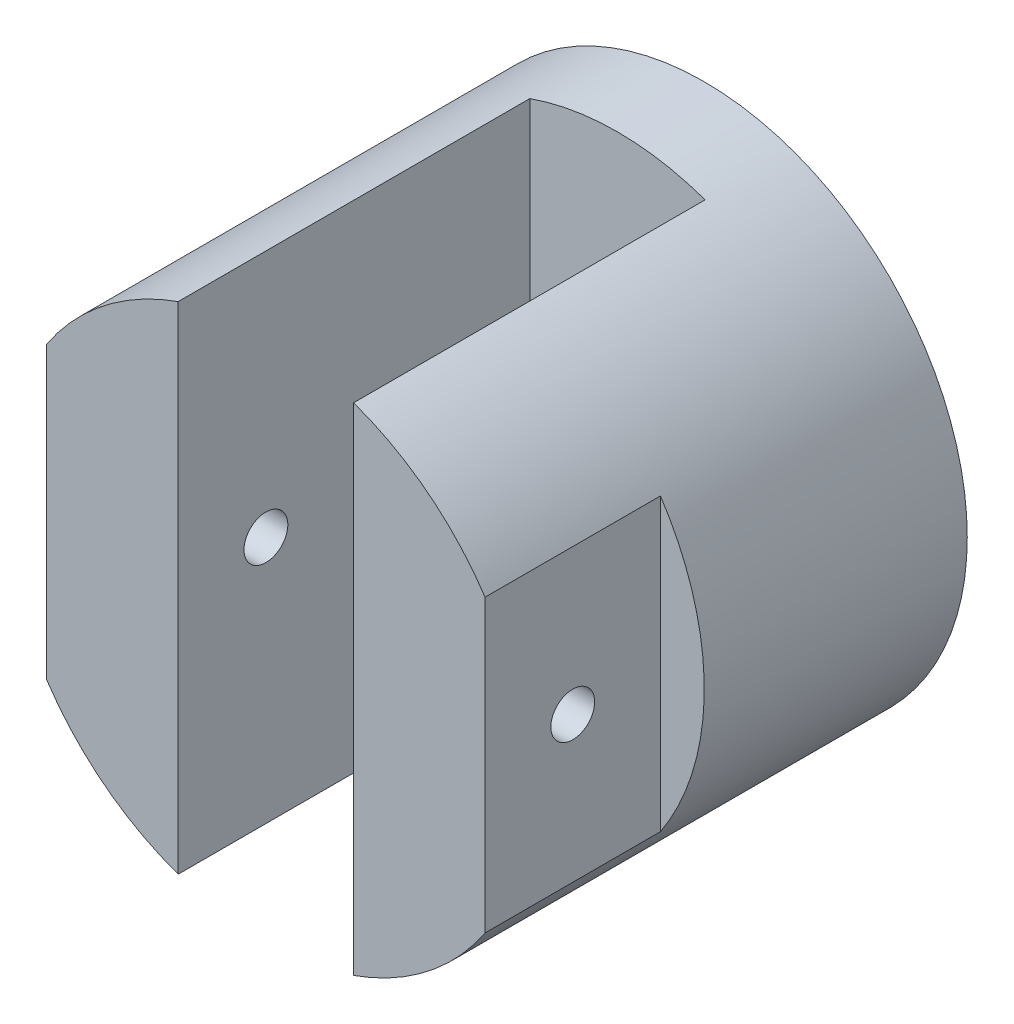
ISO-10303-21;
HEADER;
FILE_DESCRIPTION(('STEP AP214'),'2;1');
FILE_NAME('part.step','',(''),(''),'','','');
FILE_SCHEMA(('AUTOMOTIVE_DESIGN { 1 0 10303 214 1 1 1 1 }'));
ENDSEC;
DATA;
#1=APPLICATION_CONTEXT('core data for automotive mechanical design processes');
#2=APPLICATION_PROTOCOL_DEFINITION('international standard','automotive_design',2000,#1);
#3=PRODUCT_CONTEXT('',#1,'mechanical');
#4=PRODUCT('Part','Part','',(#3));
#5=PRODUCT_RELATED_PRODUCT_CATEGORY('part','',(#4));
#6=PRODUCT_DEFINITION_FORMATION('','',#4);
#7=PRODUCT_DEFINITION_CONTEXT('part definition',#1,'design');
#8=PRODUCT_DEFINITION('design','',#6,#7);
#9=PRODUCT_DEFINITION_SHAPE('','',#8);
#10=(LENGTH_UNIT() NAMED_UNIT(*) SI_UNIT(.MILLI.,.METRE.));
#11=(NAMED_UNIT(*) PLANE_ANGLE_UNIT() SI_UNIT($,.RADIAN.));
#12=(NAMED_UNIT(*) SI_UNIT($,.STERADIAN.) SOLID_ANGLE_UNIT());
#13=UNCERTAINTY_MEASURE_WITH_UNIT(LENGTH_MEASURE(1.E-05),#10,'distance_accuracy_value','');
#14=(GEOMETRIC_REPRESENTATION_CONTEXT(3) GLOBAL_UNCERTAINTY_ASSIGNED_CONTEXT((#13)) GLOBAL_UNIT_ASSIGNED_CONTEXT((#10,
#11,#12)) REPRESENTATION_CONTEXT('',''));
#15=CARTESIAN_POINT('',(0.,0.,0.));
#16=DIRECTION('',(0.,0.,1.));
#17=DIRECTION('',(1.,0.,0.));
#18=AXIS2_PLACEMENT_3D('',#15,#16,#17);
#19=CARTESIAN_POINT('',(0.,0.,63.5));
#20=DIRECTION('',(0.,0.,1.));
#21=DIRECTION('',(1.,0.,0.));
#22=AXIS2_PLACEMENT_3D('',#19,#20,#21);
#23=PLANE('',#22);
#24=CARTESIAN_POINT('',(0.,0.,63.5));
#25=DIRECTION('',(0.,0.,1.));
#26=DIRECTION('',(1.,0.,0.));
#27=AXIS2_PLACEMENT_3D('',#24,#25,#26);
#28=CIRCLE('',#27,38.1);
#29=CARTESIAN_POINT('',(12.7,-35.9210244842766,63.5));
#30=VERTEX_POINT('',#29);
#31=CARTESIAN_POINT('',(31.75,-21.0605674187568,63.5));
#32=VERTEX_POINT('',#31);
#33=EDGE_CURVE('E110',#30,#32,#28,.T.);
#34=ORIENTED_EDGE('',*,*,#33,.T.);
#35=DIRECTION('',(0.,1.,0.));
#36=VECTOR('',#35,1.);
#37=CARTESIAN_POINT('',(31.75,-35.9210244842766,63.5));
#38=LINE('',#37,#36);
#39=CARTESIAN_POINT('',(31.75,21.0605674187568,63.5));
#40=VERTEX_POINT('',#39);
#41=EDGE_CURVE('E96',#32,#40,#38,.T.);
#42=ORIENTED_EDGE('',*,*,#41,.T.);
#43=CARTESIAN_POINT('',(12.7,35.9210244842766,63.5));
#44=VERTEX_POINT('',#43);
#45=EDGE_CURVE('E116',#40,#44,#28,.T.);
#46=ORIENTED_EDGE('',*,*,#45,.T.);
#47=DIRECTION('',(0.,1.,0.));
#48=VECTOR('',#47,1.);
#49=CARTESIAN_POINT('',(12.7,-50.8,63.5));
#50=LINE('',#49,#48);
#51=EDGE_CURVE('E114',#30,#44,#50,.T.);
#52=ORIENTED_EDGE('',*,*,#51,.F.);
#53=EDGE_LOOP('',(#34,#42,#46,#52));
#54=FACE_BOUND('',#53,.T.);
#55=ADVANCED_FACE('F33',(#54),#23,.T.);
#56=CARTESIAN_POINT('',(-50.8,0.,50.8));
#57=DIRECTION('',(1.,0.,0.));
#58=DIRECTION('',(0.,0.,-1.));
#59=AXIS2_PLACEMENT_3D('',#56,#57,#58);
#60=CYLINDRICAL_SURFACE('',#59,3.175);
#61=CARTESIAN_POINT('',(12.7,0.,50.8));
#62=DIRECTION('',(1.,0.,0.));
#63=DIRECTION('',(0.,0.,-1.));
#64=AXIS2_PLACEMENT_3D('',#61,#62,#63);
#65=CIRCLE('',#64,3.175);
#66=CARTESIAN_POINT('',(12.7,0.,47.625));
#67=VERTEX_POINT('',#66);
#68=EDGE_CURVE('E135',#67,#67,#65,.F.);
#69=ORIENTED_EDGE('',*,*,#68,.T.);
#70=EDGE_LOOP('',(#69));
#71=FACE_BOUND('',#70,.T.);
#72=CARTESIAN_POINT('',(31.75,0.,50.8));
#73=DIRECTION('',(1.,0.,0.));
#74=DIRECTION('',(0.,0.,-1.));
#75=AXIS2_PLACEMENT_3D('',#72,#73,#74);
#76=CIRCLE('',#75,3.175);
#77=CARTESIAN_POINT('',(31.75,0.,47.625));
#78=VERTEX_POINT('',#77);
#79=EDGE_CURVE('E152',#78,#78,#76,.F.);
#80=ORIENTED_EDGE('',*,*,#79,.F.);
#81=EDGE_LOOP('',(#80));
#82=FACE_BOUND('',#81,.T.);
#83=ADVANCED_FACE('F215',(#71,#82),#60,.F.);
#84=CARTESIAN_POINT('',(0.,0.,63.5));
#85=DIRECTION('',(0.,0.,-1.));
#86=DIRECTION('',(-1.,0.,0.));
#87=AXIS2_PLACEMENT_3D('',#84,#85,#86);
#88=CYLINDRICAL_SURFACE('',#87,38.1);
#89=CARTESIAN_POINT('',(0.,0.,0.));
#90=DIRECTION('',(0.,0.,1.));
#91=DIRECTION('',(1.,0.,0.));
#92=AXIS2_PLACEMENT_3D('',#89,#90,#91);
#93=CIRCLE('',#92,38.1);
#94=CARTESIAN_POINT('',(38.1,0.,0.));
#95=VERTEX_POINT('',#94);
#96=EDGE_CURVE('E120',#95,#95,#93,.T.);
#97=ORIENTED_EDGE('',*,*,#96,.T.);
#98=EDGE_LOOP('',(#97));
#99=FACE_BOUND('',#98,.T.);
#100=DIRECTION('',(0.,0.,-1.));
#101=VECTOR('',#100,1.);
#102=CARTESIAN_POINT('',(31.75,-21.0605674187568,63.5));
#103=LINE('',#102,#101);
#104=CARTESIAN_POINT('',(31.75,-21.0605674187568,38.1));
#105=VERTEX_POINT('',#104);
#106=EDGE_CURVE('E12',#32,#105,#103,.T.);
#107=ORIENTED_EDGE('',*,*,#106,.F.);
#108=ORIENTED_EDGE('',*,*,#33,.F.);
#109=DIRECTION('',(0.,0.,-1.));
#110=VECTOR('',#109,1.);
#111=CARTESIAN_POINT('',(12.7,-35.9210244842766,63.5));
#112=LINE('',#111,#110);
#113=CARTESIAN_POINT('',(12.7,-35.9210244842766,12.573));
#114=VERTEX_POINT('',#113);
#115=EDGE_CURVE('E176',#30,#114,#112,.T.);
#116=ORIENTED_EDGE('',*,*,#115,.T.);
#117=CARTESIAN_POINT('',(0.,0.,12.573));
#118=DIRECTION('',(0.,0.,-1.));
#119=DIRECTION('',(-1.,0.,0.));
#120=AXIS2_PLACEMENT_3D('',#117,#118,#119);
#121=CIRCLE('',#120,38.1);
#122=CARTESIAN_POINT('',(-12.7,-35.9210244842766,12.573));
#123=VERTEX_POINT('',#122);
#124=EDGE_CURVE('E124',#114,#123,#121,.T.);
#125=ORIENTED_EDGE('',*,*,#124,.T.);
#126=DIRECTION('',(0.,0.,-1.));
#127=VECTOR('',#126,1.);
#128=CARTESIAN_POINT('',(-12.7,-35.9210244842766,63.5));
#129=LINE('',#128,#127);
#130=CARTESIAN_POINT('',(-12.7,-35.9210244842766,63.5));
#131=VERTEX_POINT('',#130);
#132=EDGE_CURVE('E171',#123,#131,#129,.F.);
#133=ORIENTED_EDGE('',*,*,#132,.T.);
#134=CARTESIAN_POINT('',(-31.75,-21.0605674187568,63.5));
#135=VERTEX_POINT('',#134);
#136=EDGE_CURVE('E115',#135,#131,#28,.T.);
#137=ORIENTED_EDGE('',*,*,#136,.F.);
#138=DIRECTION('',(0.,0.,-1.));
#139=VECTOR('',#138,1.);
#140=CARTESIAN_POINT('',(-31.75,-21.0605674187568,63.5));
#141=LINE('',#140,#139);
#142=CARTESIAN_POINT('',(-31.75,-21.0605674187568,38.1));
#143=VERTEX_POINT('',#142);
#144=EDGE_CURVE('E55',#143,#135,#141,.F.);
#145=ORIENTED_EDGE('',*,*,#144,.F.);
#146=CARTESIAN_POINT('',(0.,0.,38.1));
#147=DIRECTION('',(0.,0.,1.));
#148=DIRECTION('',(1.,0.,0.));
#149=AXIS2_PLACEMENT_3D('',#146,#147,#148);
#150=CIRCLE('',#149,38.1);
#151=CARTESIAN_POINT('',(-31.75,21.0605674187568,38.1));
#152=VERTEX_POINT('',#151);
#153=EDGE_CURVE('E139',#152,#143,#150,.T.);
#154=ORIENTED_EDGE('',*,*,#153,.F.);
#155=DIRECTION('',(0.,0.,-1.));
#156=VECTOR('',#155,1.);
#157=CARTESIAN_POINT('',(-31.75,21.0605674187568,63.5));
#158=LINE('',#157,#156);
#159=CARTESIAN_POINT('',(-31.75,21.0605674187568,63.5));
#160=VERTEX_POINT('',#159);
#161=EDGE_CURVE('E142',#160,#152,#158,.T.);
#162=ORIENTED_EDGE('',*,*,#161,.F.);
#163=CARTESIAN_POINT('',(-12.7,35.9210244842766,63.5));
#164=VERTEX_POINT('',#163);
#165=EDGE_CURVE('E118',#164,#160,#28,.T.);
#166=ORIENTED_EDGE('',*,*,#165,.F.);
#167=DIRECTION('',(0.,0.,-1.));
#168=VECTOR('',#167,1.);
#169=CARTESIAN_POINT('',(-12.7,35.9210244842766,63.5));
#170=LINE('',#169,#168);
#171=CARTESIAN_POINT('',(-12.7,35.9210244842766,12.573));
#172=VERTEX_POINT('',#171);
#173=EDGE_CURVE('E173',#164,#172,#170,.T.);
#174=ORIENTED_EDGE('',*,*,#173,.T.);
#175=CARTESIAN_POINT('',(12.7,35.9210244842766,12.573));
#176=VERTEX_POINT('',#175);
#177=EDGE_CURVE('E129',#172,#176,#121,.T.);
#178=ORIENTED_EDGE('',*,*,#177,.T.);
#179=DIRECTION('',(0.,0.,-1.));
#180=VECTOR('',#179,1.);
#181=CARTESIAN_POINT('',(12.7,35.9210244842766,63.5));
#182=LINE('',#181,#180);
#183=EDGE_CURVE('E175',#176,#44,#182,.F.);
#184=ORIENTED_EDGE('',*,*,#183,.T.);
#185=ORIENTED_EDGE('',*,*,#45,.F.);
#186=DIRECTION('',(0.,0.,-1.));
#187=VECTOR('',#186,1.);
#188=CARTESIAN_POINT('',(31.75,21.0605674187568,63.5));
#189=LINE('',#188,#187);
#190=CARTESIAN_POINT('',(31.75,21.0605674187568,38.1));
#191=VERTEX_POINT('',#190);
#192=EDGE_CURVE('E41',#191,#40,#189,.F.);
#193=ORIENTED_EDGE('',*,*,#192,.F.);
#194=EDGE_CURVE('E111',#105,#191,#150,.T.);
#195=ORIENTED_EDGE('',*,*,#194,.F.);
#196=EDGE_LOOP('',(#107,#108,#116,#125,#133,#137,#145,#154,#162,#166,#174,#178,#184,#185,#193,#195));
#197=FACE_BOUND('',#196,.T.);
#198=ADVANCED_FACE('F35',(#99,#197),#88,.T.);
#199=ORIENTED_EDGE('',*,*,#165,.T.);
#200=DIRECTION('',(0.,-1.,0.));
#201=VECTOR('',#200,1.);
#202=CARTESIAN_POINT('',(-31.75,-35.9210244842766,63.5));
#203=LINE('',#202,#201);
#204=EDGE_CURVE('E105',#160,#135,#203,.T.);
#205=ORIENTED_EDGE('',*,*,#204,.T.);
#206=ORIENTED_EDGE('',*,*,#136,.T.);
#207=DIRECTION('',(0.,1.,0.));
#208=VECTOR('',#207,1.);
#209=CARTESIAN_POINT('',(-12.7,-50.8,63.5));
#210=LINE('',#209,#208);
#211=EDGE_CURVE('E164',#131,#164,#210,.T.);
#212=ORIENTED_EDGE('',*,*,#211,.T.);
#213=EDGE_LOOP('',(#199,#205,#206,#212));
#214=FACE_BOUND('',#213,.T.);
#215=ADVANCED_FACE('F194',(#214),#23,.T.);
#216=CARTESIAN_POINT('',(-12.7,0.,50.8));
#217=DIRECTION('',(-1.,0.,0.));
#218=DIRECTION('',(0.,0.,1.));
#219=AXIS2_PLACEMENT_3D('',#216,#217,#218);
#220=CIRCLE('',#219,3.175);
#221=CARTESIAN_POINT('',(-12.7,0.,53.975));
#222=VERTEX_POINT('',#221);
#223=EDGE_CURVE('E163',#222,#222,#220,.F.);
#224=ORIENTED_EDGE('',*,*,#223,.T.);
#225=EDGE_LOOP('',(#224));
#226=FACE_BOUND('',#225,.T.);
#227=CARTESIAN_POINT('',(-31.75,0.,50.8));
#228=DIRECTION('',(-1.,0.,0.));
#229=DIRECTION('',(0.,0.,1.));
#230=AXIS2_PLACEMENT_3D('',#227,#228,#229);
#231=CIRCLE('',#230,3.175);
#232=CARTESIAN_POINT('',(-31.75,0.,53.975));
#233=VERTEX_POINT('',#232);
#234=EDGE_CURVE('E137',#233,#233,#231,.F.);
#235=ORIENTED_EDGE('',*,*,#234,.F.);
#236=EDGE_LOOP('',(#235));
#237=FACE_BOUND('',#236,.T.);
#238=ADVANCED_FACE('F183',(#226,#237),#60,.F.);
#239=CARTESIAN_POINT('',(0.,0.,0.));
#240=DIRECTION('',(0.,0.,1.));
#241=DIRECTION('',(1.,0.,0.));
#242=AXIS2_PLACEMENT_3D('',#239,#240,#241);
#243=PLANE('',#242);
#244=CARTESIAN_POINT('',(0.,0.,0.));
#245=DIRECTION('',(0.,0.,1.));
#246=DIRECTION('',(1.,0.,0.));
#247=AXIS2_PLACEMENT_3D('',#244,#245,#246);
#248=CIRCLE('',#247,7.9375);
#249=CARTESIAN_POINT('',(7.9375,0.,0.));
#250=VERTEX_POINT('',#249);
#251=EDGE_CURVE('E156',#250,#250,#248,.T.);
#252=ORIENTED_EDGE('',*,*,#251,.T.);
#253=EDGE_LOOP('',(#252));
#254=FACE_BOUND('',#253,.T.);
#255=ORIENTED_EDGE('',*,*,#96,.F.);
#256=EDGE_LOOP('',(#255));
#257=FACE_BOUND('',#256,.T.);
#258=ADVANCED_FACE('F227',(#254,#257),#243,.F.);
#259=CARTESIAN_POINT('',(-12.7,-50.8,12.573));
#260=DIRECTION('',(0.,0.,-1.));
#261=DIRECTION('',(-1.,0.,0.));
#262=AXIS2_PLACEMENT_3D('',#259,#260,#261);
#263=PLANE('',#262);
#264=CARTESIAN_POINT('',(0.,0.,12.573));
#265=DIRECTION('',(0.,0.,1.));
#266=DIRECTION('',(1.,0.,0.));
#267=AXIS2_PLACEMENT_3D('',#264,#265,#266);
#268=CIRCLE('',#267,7.9375);
#269=CARTESIAN_POINT('',(7.9375,0.,12.573));
#270=VERTEX_POINT('',#269);
#271=EDGE_CURVE('E155',#270,#270,#268,.T.);
#272=ORIENTED_EDGE('',*,*,#271,.F.);
#273=EDGE_LOOP('',(#272));
#274=FACE_BOUND('',#273,.T.);
#275=DIRECTION('',(0.,1.,0.));
#276=VECTOR('',#275,1.);
#277=CARTESIAN_POINT('',(-12.7,-50.8,12.573));
#278=LINE('',#277,#276);
#279=EDGE_CURVE('E166',#123,#172,#278,.T.);
#280=ORIENTED_EDGE('',*,*,#279,.F.);
#281=ORIENTED_EDGE('',*,*,#124,.F.);
#282=DIRECTION('',(0.,1.,0.));
#283=VECTOR('',#282,1.);
#284=CARTESIAN_POINT('',(12.7,-50.8,12.573));
#285=LINE('',#284,#283);
#286=EDGE_CURVE('E159',#114,#176,#285,.T.);
#287=ORIENTED_EDGE('',*,*,#286,.T.);
#288=ORIENTED_EDGE('',*,*,#177,.F.);
#289=EDGE_LOOP('',(#280,#281,#287,#288));
#290=FACE_BOUND('',#289,.T.);
#291=ADVANCED_FACE('F254',(#274,#290),#263,.F.);
#292=CARTESIAN_POINT('',(12.7,-50.8,12.573));
#293=DIRECTION('',(1.,0.,0.));
#294=DIRECTION('',(0.,0.,-1.));
#295=AXIS2_PLACEMENT_3D('',#292,#293,#294);
#296=PLANE('',#295);
#297=ORIENTED_EDGE('',*,*,#68,.F.);
#298=EDGE_LOOP('',(#297));
#299=FACE_BOUND('',#298,.T.);
#300=ORIENTED_EDGE('',*,*,#51,.T.);
#301=ORIENTED_EDGE('',*,*,#183,.F.);
#302=ORIENTED_EDGE('',*,*,#286,.F.);
#303=ORIENTED_EDGE('',*,*,#115,.F.);
#304=EDGE_LOOP('',(#300,#301,#302,#303));
#305=FACE_BOUND('',#304,.T.);
#306=ADVANCED_FACE('F190',(#299,#305),#296,.F.);
#307=CARTESIAN_POINT('',(-12.7,-50.8,12.573));
#308=DIRECTION('',(-1.,0.,0.));
#309=DIRECTION('',(0.,0.,1.));
#310=AXIS2_PLACEMENT_3D('',#307,#308,#309);
#311=PLANE('',#310);
#312=ORIENTED_EDGE('',*,*,#223,.F.);
#313=EDGE_LOOP('',(#312));
#314=FACE_BOUND('',#313,.T.);
#315=ORIENTED_EDGE('',*,*,#211,.F.);
#316=ORIENTED_EDGE('',*,*,#132,.F.);
#317=ORIENTED_EDGE('',*,*,#279,.T.);
#318=ORIENTED_EDGE('',*,*,#173,.F.);
#319=EDGE_LOOP('',(#315,#316,#317,#318));
#320=FACE_BOUND('',#319,.T.);
#321=ADVANCED_FACE('F186',(#314,#320),#311,.F.);
#322=CARTESIAN_POINT('',(0.,0.,0.));
#323=DIRECTION('',(0.,0.,1.));
#324=DIRECTION('',(1.,0.,0.));
#325=AXIS2_PLACEMENT_3D('',#322,#323,#324);
#326=CYLINDRICAL_SURFACE('',#325,7.9375);
#327=ORIENTED_EDGE('',*,*,#251,.F.);
#328=EDGE_LOOP('',(#327));
#329=FACE_BOUND('',#328,.T.);
#330=ORIENTED_EDGE('',*,*,#271,.T.);
#331=EDGE_LOOP('',(#330));
#332=FACE_BOUND('',#331,.T.);
#333=ADVANCED_FACE('F189',(#329,#332),#326,.F.);
#334=CARTESIAN_POINT('',(-31.75,-35.9210244842766,38.1));
#335=DIRECTION('',(-1.,0.,0.));
#336=DIRECTION('',(0.,0.,1.));
#337=AXIS2_PLACEMENT_3D('',#334,#335,#336);
#338=PLANE('',#337);
#339=ORIENTED_EDGE('',*,*,#234,.T.);
#340=EDGE_LOOP('',(#339));
#341=FACE_BOUND('',#340,.T.);
#342=ORIENTED_EDGE('',*,*,#161,.T.);
#343=DIRECTION('',(0.,-1.,0.));
#344=VECTOR('',#343,1.);
#345=CARTESIAN_POINT('',(-31.75,-35.9210244842766,38.1));
#346=LINE('',#345,#344);
#347=EDGE_CURVE('E148',#152,#143,#346,.T.);
#348=ORIENTED_EDGE('',*,*,#347,.T.);
#349=ORIENTED_EDGE('',*,*,#144,.T.);
#350=ORIENTED_EDGE('',*,*,#204,.F.);
#351=EDGE_LOOP('',(#342,#348,#349,#350));
#352=FACE_BOUND('',#351,.T.);
#353=ADVANCED_FACE('F198',(#341,#352),#338,.T.);
#354=CARTESIAN_POINT('',(0.,0.,38.1));
#355=DIRECTION('',(0.,0.,1.));
#356=DIRECTION('',(1.,0.,0.));
#357=AXIS2_PLACEMENT_3D('',#354,#355,#356);
#358=PLANE('',#357);
#359=ORIENTED_EDGE('',*,*,#153,.T.);
#360=ORIENTED_EDGE('',*,*,#347,.F.);
#361=EDGE_LOOP('',(#359,#360));
#362=FACE_BOUND('',#361,.T.);
#363=ADVANCED_FACE('F199',(#362),#358,.T.);
#364=CARTESIAN_POINT('',(31.75,-35.9210244842766,38.1));
#365=DIRECTION('',(1.,0.,0.));
#366=DIRECTION('',(0.,0.,-1.));
#367=AXIS2_PLACEMENT_3D('',#364,#365,#366);
#368=PLANE('',#367);
#369=ORIENTED_EDGE('',*,*,#106,.T.);
#370=DIRECTION('',(0.,1.,0.));
#371=VECTOR('',#370,1.);
#372=CARTESIAN_POINT('',(31.75,-35.9210244842766,38.1));
#373=LINE('',#372,#371);
#374=EDGE_CURVE('E47',#105,#191,#373,.T.);
#375=ORIENTED_EDGE('',*,*,#374,.T.);
#376=ORIENTED_EDGE('',*,*,#192,.T.);
#377=ORIENTED_EDGE('',*,*,#41,.F.);
#378=EDGE_LOOP('',(#369,#375,#376,#377));
#379=FACE_BOUND('',#378,.T.);
#380=ORIENTED_EDGE('',*,*,#79,.T.);
#381=EDGE_LOOP('',(#380));
#382=FACE_BOUND('',#381,.T.);
#383=ADVANCED_FACE('F98',(#379,#382),#368,.T.);
#384=ORIENTED_EDGE('',*,*,#194,.T.);
#385=ORIENTED_EDGE('',*,*,#374,.F.);
#386=EDGE_LOOP('',(#384,#385));
#387=FACE_BOUND('',#386,.T.);
#388=ADVANCED_FACE('F204',(#387),#358,.T.);
#389=CLOSED_SHELL('',(#55,#83,#198,#215,#238,#258,#291,#306,#321,#333,#353,#363,#383,#388));
#390=MANIFOLD_SOLID_BREP('B2',#389);
#391=ADVANCED_BREP_SHAPE_REPRESENTATION('',(#18,#390),#14);
#392=SHAPE_DEFINITION_REPRESENTATION(#9,#391);
ENDSEC;
END-ISO-10303-21;
